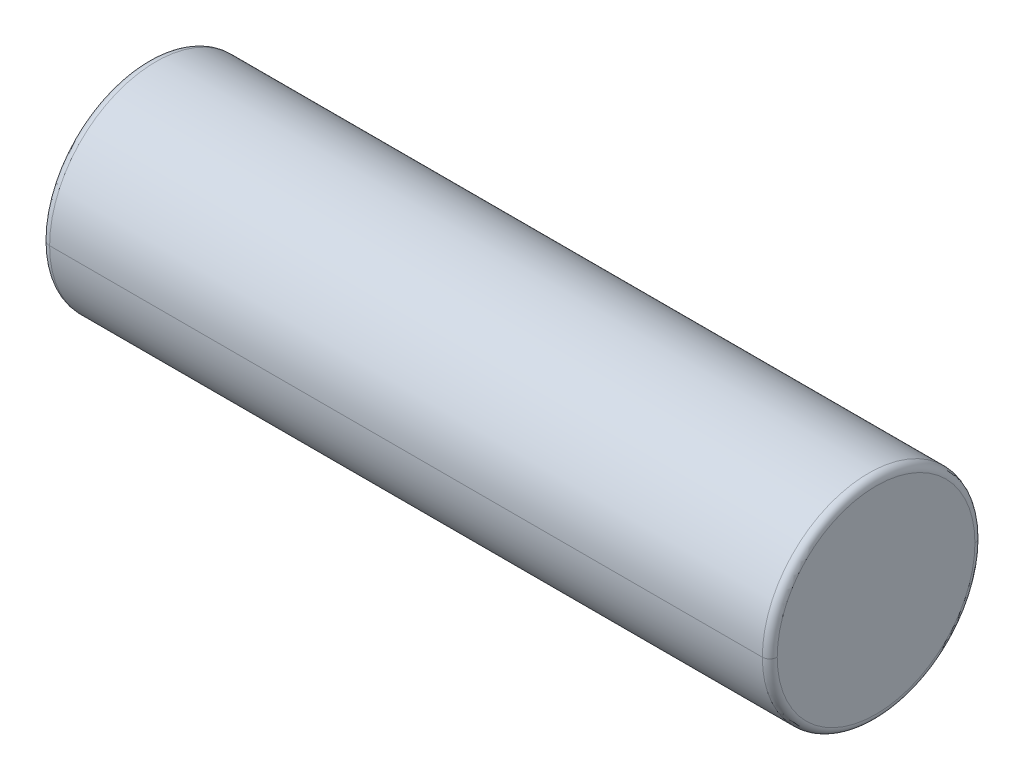
ISO-10303-21;
HEADER;
FILE_DESCRIPTION(('STEP AP214'),'2;1');
FILE_NAME('part.step','',(''),(''),'','','');
FILE_SCHEMA(('AUTOMOTIVE_DESIGN { 1 0 10303 214 1 1 1 1 }'));
ENDSEC;
DATA;
#1=APPLICATION_CONTEXT('core data for automotive mechanical design processes');
#2=APPLICATION_PROTOCOL_DEFINITION('international standard','automotive_design',2000,#1);
#3=PRODUCT_CONTEXT('',#1,'mechanical');
#4=PRODUCT('Part','Part','',(#3));
#5=PRODUCT_RELATED_PRODUCT_CATEGORY('part','',(#4));
#6=PRODUCT_DEFINITION_FORMATION('','',#4);
#7=PRODUCT_DEFINITION_CONTEXT('part definition',#1,'design');
#8=PRODUCT_DEFINITION('design','',#6,#7);
#9=PRODUCT_DEFINITION_SHAPE('','',#8);
#10=(LENGTH_UNIT() NAMED_UNIT(*) SI_UNIT(.MILLI.,.METRE.));
#11=(NAMED_UNIT(*) PLANE_ANGLE_UNIT() SI_UNIT($,.RADIAN.));
#12=(NAMED_UNIT(*) SI_UNIT($,.STERADIAN.) SOLID_ANGLE_UNIT());
#13=UNCERTAINTY_MEASURE_WITH_UNIT(LENGTH_MEASURE(1.E-05),#10,'distance_accuracy_value','');
#14=(GEOMETRIC_REPRESENTATION_CONTEXT(3) GLOBAL_UNCERTAINTY_ASSIGNED_CONTEXT((#13)) GLOBAL_UNIT_ASSIGNED_CONTEXT((#10,
#11,#12)) REPRESENTATION_CONTEXT('',''));
#15=CARTESIAN_POINT('',(0.,0.,0.));
#16=DIRECTION('',(0.,0.,1.));
#17=DIRECTION('',(1.,0.,0.));
#18=AXIS2_PLACEMENT_3D('',#15,#16,#17);
#19=CARTESIAN_POINT('',(0.,0.,0.));
#20=DIRECTION('',(-1.,0.,0.));
#21=DIRECTION('',(0.,9.063827319E-06,0.999999999958924));
#22=AXIS2_PLACEMENT_3D('',#19,#20,#21);
#23=PLANE('',#22);
#24=CARTESIAN_POINT('',(0.,0.,0.));
#25=DIRECTION('',(1.,0.,0.));
#26=DIRECTION('',(0.,-9.06382731887754E-06,-0.999999999958924));
#27=AXIS2_PLACEMENT_3D('',#24,#25,#26);
#28=CIRCLE('',#27,3.85);
#29=CARTESIAN_POINT('',(0.,3.48957351764545E-05,3.84999999984187));
#30=VERTEX_POINT('',#29);
#31=CARTESIAN_POINT('',(0.,-3.48957351764545E-05,-3.84999999984187));
#32=VERTEX_POINT('',#31);
#33=EDGE_CURVE('E11',#30,#32,#28,.T.);
#34=ORIENTED_EDGE('',*,*,#33,.F.);
#35=CARTESIAN_POINT('',(0.,0.,0.));
#36=DIRECTION('',(1.,0.,0.));
#37=DIRECTION('',(0.,-9.06382731887754E-06,-0.999999999958924));
#38=AXIS2_PLACEMENT_3D('',#35,#36,#37);
#39=CIRCLE('',#38,3.85);
#40=EDGE_CURVE('E212',#32,#30,#39,.T.);
#41=ORIENTED_EDGE('',*,*,#40,.F.);
#42=EDGE_LOOP('',(#34,#41));
#43=FACE_BOUND('',#42,.T.);
#44=ADVANCED_FACE('F52',(#43),#23,.T.);
#45=CARTESIAN_POINT('',(0.400000000000005,0.,0.));
#46=DIRECTION('',(-1.,0.,0.));
#47=DIRECTION('',(0.,9.063827319E-06,0.999999999958924));
#48=AXIS2_PLACEMENT_3D('',#45,#46,#47);
#49=TOROIDAL_SURFACE('',#48,3.85,0.4);
#50=CARTESIAN_POINT('',(0.400000000000005,3.48957351764545E-05,3.84999999984187));
#51=DIRECTION('',(0.,-0.999999999958924,9.06382731887754E-06));
#52=DIRECTION('',(0.,9.06382731887754E-06,0.999999999958924));
#53=AXIS2_PLACEMENT_3D('',#50,#51,#52);
#54=CIRCLE('',#53,0.4);
#55=CARTESIAN_POINT('',(0.400000000000005,3.8521266107483E-05,4.24999999982542));
#56=VERTEX_POINT('',#55);
#57=EDGE_CURVE('E184',#56,#30,#54,.T.);
#58=ORIENTED_EDGE('',*,*,#57,.T.);
#59=ORIENTED_EDGE('',*,*,#33,.T.);
#60=CARTESIAN_POINT('',(0.400000000000005,-3.48957351764545E-05,-3.84999999984187));
#61=DIRECTION('',(0.,-0.999999999958924,9.06382731887754E-06));
#62=DIRECTION('',(0.,-9.06382731887754E-06,-0.999999999958924));
#63=AXIS2_PLACEMENT_3D('',#60,#61,#62);
#64=CIRCLE('',#63,0.4);
#65=CARTESIAN_POINT('',(0.400000000000005,-3.8521266107483E-05,-4.24999999982542));
#66=VERTEX_POINT('',#65);
#67=EDGE_CURVE('E216',#32,#66,#64,.T.);
#68=ORIENTED_EDGE('',*,*,#67,.T.);
#69=CARTESIAN_POINT('',(0.400000000000005,0.,0.));
#70=DIRECTION('',(-1.,0.,0.));
#71=DIRECTION('',(0.,-9.06382731887754E-06,-0.999999999958924));
#72=AXIS2_PLACEMENT_3D('',#69,#70,#71);
#73=CIRCLE('',#72,4.25);
#74=EDGE_CURVE('E63',#66,#56,#73,.T.);
#75=ORIENTED_EDGE('',*,*,#74,.T.);
#76=EDGE_LOOP('',(#58,#59,#68,#75));
#77=FACE_BOUND('',#76,.T.);
#78=ADVANCED_FACE('F251',(#77),#49,.T.);
#79=CARTESIAN_POINT('',(1.5,0.,0.));
#80=DIRECTION('',(-1.,0.,0.));
#81=DIRECTION('',(0.,9.063827319E-06,0.999999999958924));
#82=AXIS2_PLACEMENT_3D('',#79,#80,#81);
#83=CYLINDRICAL_SURFACE('',#82,4.25);
#84=DIRECTION('',(-1.,0.,0.));
#85=VECTOR('',#84,1.);
#86=CARTESIAN_POINT('',(0.740000000000005,3.8521266107483E-05,4.24999999982542));
#87=LINE('',#86,#85);
#88=CARTESIAN_POINT('',(1.08,3.8521266107483E-05,4.24999999982542));
#89=VERTEX_POINT('',#88);
#90=EDGE_CURVE('E215',#89,#56,#87,.T.);
#91=ORIENTED_EDGE('',*,*,#90,.T.);
#92=ORIENTED_EDGE('',*,*,#74,.F.);
#93=DIRECTION('',(1.,0.,0.));
#94=VECTOR('',#93,1.);
#95=CARTESIAN_POINT('',(0.740000000000005,-3.8521266107483E-05,-4.24999999982542));
#96=LINE('',#95,#94);
#97=CARTESIAN_POINT('',(1.08,-3.8521266107483E-05,-4.24999999982542));
#98=VERTEX_POINT('',#97);
#99=EDGE_CURVE('E178',#66,#98,#96,.T.);
#100=ORIENTED_EDGE('',*,*,#99,.T.);
#101=CARTESIAN_POINT('',(1.08,0.,0.));
#102=DIRECTION('',(1.,0.,0.));
#103=DIRECTION('',(0.,-9.06382731887754E-06,-0.999999999958924));
#104=AXIS2_PLACEMENT_3D('',#101,#102,#103);
#105=CIRCLE('',#104,4.25);
#106=EDGE_CURVE('E169',#89,#98,#105,.T.);
#107=ORIENTED_EDGE('',*,*,#106,.F.);
#108=EDGE_LOOP('',(#91,#92,#100,#107));
#109=FACE_BOUND('',#108,.T.);
#110=ADVANCED_FACE('F257',(#109),#83,.T.);
#111=CARTESIAN_POINT('',(1.08,0.,0.));
#112=DIRECTION('',(-1.,0.,0.));
#113=DIRECTION('',(0.,9.063827319E-06,0.999999999958924));
#114=AXIS2_PLACEMENT_3D('',#111,#112,#113);
#115=TOROIDAL_SURFACE('',#114,4.67,0.42);
#116=CARTESIAN_POINT('',(1.08,-4.23280735739606E-05,-4.66999999980816));
#117=DIRECTION('',(0.,-0.999999999958924,9.06382731887754E-06));
#118=DIRECTION('',(0.,-9.06382731887754E-06,-0.999999999958924));
#119=AXIS2_PLACEMENT_3D('',#116,#117,#118);
#120=CIRCLE('',#119,0.42);
#121=CARTESIAN_POINT('',(1.5,-4.23280735739606E-05,-4.66999999980816));
#122=VERTEX_POINT('',#121);
#123=EDGE_CURVE('E172',#122,#98,#120,.T.);
#124=ORIENTED_EDGE('',*,*,#123,.T.);
#125=CARTESIAN_POINT('',(1.08,0.,0.));
#126=DIRECTION('',(1.,0.,0.));
#127=DIRECTION('',(0.,-9.06382731887754E-06,-0.999999999958924));
#128=AXIS2_PLACEMENT_3D('',#125,#126,#127);
#129=CIRCLE('',#128,4.25);
#130=EDGE_CURVE('E165',#98,#89,#129,.T.);
#131=ORIENTED_EDGE('',*,*,#130,.T.);
#132=CARTESIAN_POINT('',(1.08,4.23280735739606E-05,4.66999999980816));
#133=DIRECTION('',(0.,-0.999999999958924,9.06382731887754E-06));
#134=DIRECTION('',(0.,9.06382731887754E-06,0.999999999958924));
#135=AXIS2_PLACEMENT_3D('',#132,#133,#134);
#136=CIRCLE('',#135,0.42);
#137=CARTESIAN_POINT('',(1.5,4.23280735739606E-05,4.66999999980816));
#138=VERTEX_POINT('',#137);
#139=EDGE_CURVE('E162',#89,#138,#136,.T.);
#140=ORIENTED_EDGE('',*,*,#139,.T.);
#141=CARTESIAN_POINT('',(1.5,0.,0.));
#142=DIRECTION('',(-1.,0.,0.));
#143=DIRECTION('',(0.,-9.06382731887754E-06,-0.999999999958924));
#144=AXIS2_PLACEMENT_3D('',#141,#142,#143);
#145=CIRCLE('',#144,4.67);
#146=EDGE_CURVE('E150',#138,#122,#145,.T.);
#147=ORIENTED_EDGE('',*,*,#146,.T.);
#148=EDGE_LOOP('',(#124,#131,#140,#147));
#149=FACE_BOUND('',#148,.T.);
#150=ADVANCED_FACE('F163',(#149),#115,.F.);
#151=CARTESIAN_POINT('',(1.5,0.,0.));
#152=DIRECTION('',(-1.,0.,0.));
#153=DIRECTION('',(0.,9.063827319E-06,0.999999999958924));
#154=AXIS2_PLACEMENT_3D('',#151,#152,#153);
#155=PLANE('',#154);
#156=ORIENTED_EDGE('',*,*,#146,.F.);
#157=CARTESIAN_POINT('',(1.5,0.,0.));
#158=DIRECTION('',(-1.,0.,0.));
#159=DIRECTION('',(0.,-9.06382731887754E-06,-0.999999999958924));
#160=AXIS2_PLACEMENT_3D('',#157,#158,#159);
#161=CIRCLE('',#160,4.67);
#162=EDGE_CURVE('E154',#122,#138,#161,.T.);
#163=ORIENTED_EDGE('',*,*,#162,.F.);
#164=EDGE_LOOP('',(#156,#163));
#165=FACE_BOUND('',#164,.T.);
#166=CARTESIAN_POINT('',(1.5,0.,0.));
#167=DIRECTION('',(1.,0.,0.));
#168=DIRECTION('',(0.,9.063827319E-06,0.999999999958924));
#169=AXIS2_PLACEMENT_3D('',#166,#167,#168);
#170=CIRCLE('',#169,6.42);
#171=CARTESIAN_POINT('',(1.5,-5.81897713902713E-05,-6.4199999997363));
#172=VERTEX_POINT('',#171);
#173=CARTESIAN_POINT('',(1.5,5.81897713902713E-05,6.4199999997363));
#174=VERTEX_POINT('',#173);
#175=EDGE_CURVE('E189',#172,#174,#170,.T.);
#176=ORIENTED_EDGE('',*,*,#175,.F.);
#177=CARTESIAN_POINT('',(1.5,0.,0.));
#178=DIRECTION('',(1.,0.,0.));
#179=DIRECTION('',(0.,9.063827319E-06,0.999999999958924));
#180=AXIS2_PLACEMENT_3D('',#177,#178,#179);
#181=CIRCLE('',#180,6.42);
#182=EDGE_CURVE('E129',#174,#172,#181,.T.);
#183=ORIENTED_EDGE('',*,*,#182,.F.);
#184=EDGE_LOOP('',(#176,#183));
#185=FACE_BOUND('',#184,.T.);
#186=ADVANCED_FACE('F152',(#165,#185),#155,.T.);
#187=CARTESIAN_POINT('',(2.08000000000001,0.,0.));
#188=DIRECTION('',(1.,0.,0.));
#189=DIRECTION('',(0.,-9.063827319E-06,-0.999999999958924));
#190=AXIS2_PLACEMENT_3D('',#187,#188,#189);
#191=TOROIDAL_SURFACE('',#190,6.42,0.58);
#192=CARTESIAN_POINT('',(2.08000000000001,-5.81897713902713E-05,-6.4199999997363));
#193=DIRECTION('',(0.,-0.999999999958924,9.06382731912246E-06));
#194=DIRECTION('',(0.,-9.06382731912246E-06,-0.999999999958924));
#195=AXIS2_PLACEMENT_3D('',#192,#193,#194);
#196=CIRCLE('',#195,0.58);
#197=CARTESIAN_POINT('',(2.08000000000001,-6.3446791237487E-05,-6.99999999971246));
#198=VERTEX_POINT('',#197);
#199=EDGE_CURVE('E192',#172,#198,#196,.T.);
#200=ORIENTED_EDGE('',*,*,#199,.T.);
#201=CARTESIAN_POINT('',(2.08000000000001,0.,0.));
#202=DIRECTION('',(-1.,0.,0.));
#203=DIRECTION('',(0.,9.063827319E-06,0.999999999958924));
#204=AXIS2_PLACEMENT_3D('',#201,#202,#203);
#205=CIRCLE('',#204,7.);
#206=CARTESIAN_POINT('',(2.08000000000001,6.3446791237487E-05,6.99999999971246));
#207=VERTEX_POINT('',#206);
#208=EDGE_CURVE('E118',#198,#207,#205,.T.);
#209=ORIENTED_EDGE('',*,*,#208,.T.);
#210=CARTESIAN_POINT('',(2.08000000000001,5.81897713902713E-05,6.4199999997363));
#211=DIRECTION('',(0.,-0.999999999958924,9.06382731912246E-06));
#212=DIRECTION('',(0.,9.06382731912246E-06,0.999999999958924));
#213=AXIS2_PLACEMENT_3D('',#210,#211,#212);
#214=CIRCLE('',#213,0.58);
#215=EDGE_CURVE('E182',#207,#174,#214,.T.);
#216=ORIENTED_EDGE('',*,*,#215,.T.);
#217=ORIENTED_EDGE('',*,*,#182,.T.);
#218=EDGE_LOOP('',(#200,#209,#216,#217));
#219=FACE_BOUND('',#218,.T.);
#220=ADVANCED_FACE('F279',(#219),#191,.T.);
#221=CARTESIAN_POINT('',(49.5,0.,0.));
#222=DIRECTION('',(-1.,0.,0.));
#223=DIRECTION('',(0.,9.063827319E-06,0.999999999958924));
#224=AXIS2_PLACEMENT_3D('',#221,#222,#223);
#225=PLANE('',#224);
#226=CARTESIAN_POINT('',(49.5,0.,0.));
#227=DIRECTION('',(-1.,0.,0.));
#228=DIRECTION('',(0.,9.063827319E-06,0.999999999958924));
#229=AXIS2_PLACEMENT_3D('',#226,#227,#228);
#230=CIRCLE('',#229,6.51);
#231=CARTESIAN_POINT('',(49.5,-5.90055158483649E-05,-6.50999999973259));
#232=VERTEX_POINT('',#231);
#233=CARTESIAN_POINT('',(49.5,5.90055158483649E-05,6.50999999973259));
#234=VERTEX_POINT('',#233);
#235=EDGE_CURVE('E75',#232,#234,#230,.T.);
#236=ORIENTED_EDGE('',*,*,#235,.F.);
#237=CARTESIAN_POINT('',(49.5,0.,0.));
#238=DIRECTION('',(-1.,0.,0.));
#239=DIRECTION('',(0.,9.063827319E-06,0.999999999958924));
#240=AXIS2_PLACEMENT_3D('',#237,#238,#239);
#241=CIRCLE('',#240,6.51);
#242=EDGE_CURVE('E221',#234,#232,#241,.T.);
#243=ORIENTED_EDGE('',*,*,#242,.F.);
#244=EDGE_LOOP('',(#236,#243));
#245=FACE_BOUND('',#244,.T.);
#246=ADVANCED_FACE('F275',(#245),#225,.F.);
#247=CARTESIAN_POINT('',(49.5,0.,0.));
#248=DIRECTION('',(-1.,0.,0.));
#249=DIRECTION('',(0.,9.063827319E-06,0.999999999958924));
#250=AXIS2_PLACEMENT_3D('',#247,#248,#249);
#251=CYLINDRICAL_SURFACE('',#250,7.);
#252=DIRECTION('',(-1.,0.,0.));
#253=VECTOR('',#252,1.);
#254=CARTESIAN_POINT('',(25.545,6.3446791237487E-05,6.99999999971246));
#255=LINE('',#254,#253);
#256=CARTESIAN_POINT('',(49.01,6.3446791237487E-05,6.99999999971246));
#257=VERTEX_POINT('',#256);
#258=EDGE_CURVE('E226',#257,#207,#255,.T.);
#259=ORIENTED_EDGE('',*,*,#258,.T.);
#260=ORIENTED_EDGE('',*,*,#208,.F.);
#261=DIRECTION('',(1.,0.,0.));
#262=VECTOR('',#261,1.);
#263=CARTESIAN_POINT('',(25.545,-6.3446791237487E-05,-6.99999999971246));
#264=LINE('',#263,#262);
#265=CARTESIAN_POINT('',(49.01,-6.3446791237487E-05,-6.99999999971246));
#266=VERTEX_POINT('',#265);
#267=EDGE_CURVE('E209',#198,#266,#264,.T.);
#268=ORIENTED_EDGE('',*,*,#267,.T.);
#269=CARTESIAN_POINT('',(49.01,0.,0.));
#270=DIRECTION('',(1.,0.,0.));
#271=DIRECTION('',(0.,9.063827319E-06,0.999999999958924));
#272=AXIS2_PLACEMENT_3D('',#269,#270,#271);
#273=CIRCLE('',#272,7.);
#274=EDGE_CURVE('E108',#257,#266,#273,.T.);
#275=ORIENTED_EDGE('',*,*,#274,.F.);
#276=EDGE_LOOP('',(#259,#260,#268,#275));
#277=FACE_BOUND('',#276,.T.);
#278=ADVANCED_FACE('F278',(#277),#251,.T.);
#279=CARTESIAN_POINT('',(49.01,0.,0.));
#280=DIRECTION('',(-1.,0.,0.));
#281=DIRECTION('',(0.,9.063827319E-06,0.999999999958924));
#282=AXIS2_PLACEMENT_3D('',#279,#280,#281);
#283=TOROIDAL_SURFACE('',#282,6.51,0.49);
#284=CARTESIAN_POINT('',(49.01,5.90055158483649E-05,6.50999999973259));
#285=DIRECTION('',(0.,-0.999999999958924,9.06382731887754E-06));
#286=DIRECTION('',(0.,9.06382731887754E-06,0.999999999958924));
#287=AXIS2_PLACEMENT_3D('',#284,#285,#286);
#288=CIRCLE('',#287,0.49);
#289=EDGE_CURVE('E56',#234,#257,#288,.T.);
#290=ORIENTED_EDGE('',*,*,#289,.T.);
#291=ORIENTED_EDGE('',*,*,#274,.T.);
#292=CARTESIAN_POINT('',(49.01,-5.90055158483649E-05,-6.50999999973259));
#293=DIRECTION('',(0.,-0.999999999958924,9.06382731887754E-06));
#294=DIRECTION('',(0.,-9.06382731887754E-06,-0.999999999958924));
#295=AXIS2_PLACEMENT_3D('',#292,#293,#294);
#296=CIRCLE('',#295,0.49);
#297=EDGE_CURVE('E225',#266,#232,#296,.T.);
#298=ORIENTED_EDGE('',*,*,#297,.T.);
#299=ORIENTED_EDGE('',*,*,#235,.T.);
#300=EDGE_LOOP('',(#290,#291,#298,#299));
#301=FACE_BOUND('',#300,.T.);
#302=ADVANCED_FACE('F283',(#301),#283,.T.);
#303=CARTESIAN_POINT('',(49.01,0.,0.));
#304=DIRECTION('',(-1.,0.,0.));
#305=DIRECTION('',(0.,9.063827319E-06,0.999999999958924));
#306=AXIS2_PLACEMENT_3D('',#303,#304,#305);
#307=TOROIDAL_SURFACE('',#306,6.51,0.49);
#308=ORIENTED_EDGE('',*,*,#289,.F.);
#309=ORIENTED_EDGE('',*,*,#242,.T.);
#310=ORIENTED_EDGE('',*,*,#297,.F.);
#311=CARTESIAN_POINT('',(49.01,0.,0.));
#312=DIRECTION('',(1.,0.,0.));
#313=DIRECTION('',(0.,9.063827319E-06,0.999999999958924));
#314=AXIS2_PLACEMENT_3D('',#311,#312,#313);
#315=CIRCLE('',#314,7.);
#316=EDGE_CURVE('E211',#266,#257,#315,.T.);
#317=ORIENTED_EDGE('',*,*,#316,.T.);
#318=EDGE_LOOP('',(#308,#309,#310,#317));
#319=FACE_BOUND('',#318,.T.);
#320=ADVANCED_FACE('F280',(#319),#307,.T.);
#321=CARTESIAN_POINT('',(49.5,0.,0.));
#322=DIRECTION('',(-1.,0.,0.));
#323=DIRECTION('',(0.,9.063827319E-06,0.999999999958924));
#324=AXIS2_PLACEMENT_3D('',#321,#322,#323);
#325=CYLINDRICAL_SURFACE('',#324,7.);
#326=ORIENTED_EDGE('',*,*,#258,.F.);
#327=ORIENTED_EDGE('',*,*,#316,.F.);
#328=ORIENTED_EDGE('',*,*,#267,.F.);
#329=CARTESIAN_POINT('',(2.08000000000001,0.,0.));
#330=DIRECTION('',(-1.,0.,0.));
#331=DIRECTION('',(0.,9.063827319E-06,0.999999999958924));
#332=AXIS2_PLACEMENT_3D('',#329,#330,#331);
#333=CIRCLE('',#332,7.);
#334=EDGE_CURVE('E229',#207,#198,#333,.T.);
#335=ORIENTED_EDGE('',*,*,#334,.F.);
#336=EDGE_LOOP('',(#326,#327,#328,#335));
#337=FACE_BOUND('',#336,.T.);
#338=ADVANCED_FACE('F54',(#337),#325,.T.);
#339=CARTESIAN_POINT('',(2.08000000000001,0.,0.));
#340=DIRECTION('',(1.,0.,0.));
#341=DIRECTION('',(0.,-9.063827319E-06,-0.999999999958924));
#342=AXIS2_PLACEMENT_3D('',#339,#340,#341);
#343=TOROIDAL_SURFACE('',#342,6.42,0.58);
#344=ORIENTED_EDGE('',*,*,#199,.F.);
#345=ORIENTED_EDGE('',*,*,#175,.T.);
#346=ORIENTED_EDGE('',*,*,#215,.F.);
#347=ORIENTED_EDGE('',*,*,#334,.T.);
#348=EDGE_LOOP('',(#344,#345,#346,#347));
#349=FACE_BOUND('',#348,.T.);
#350=ADVANCED_FACE('F285',(#349),#343,.T.);
#351=CARTESIAN_POINT('',(1.08,0.,0.));
#352=DIRECTION('',(-1.,0.,0.));
#353=DIRECTION('',(0.,9.063827319E-06,0.999999999958924));
#354=AXIS2_PLACEMENT_3D('',#351,#352,#353);
#355=TOROIDAL_SURFACE('',#354,4.67,0.42);
#356=ORIENTED_EDGE('',*,*,#123,.F.);
#357=ORIENTED_EDGE('',*,*,#162,.T.);
#358=ORIENTED_EDGE('',*,*,#139,.F.);
#359=ORIENTED_EDGE('',*,*,#106,.T.);
#360=EDGE_LOOP('',(#356,#357,#358,#359));
#361=FACE_BOUND('',#360,.T.);
#362=ADVANCED_FACE('F171',(#361),#355,.F.);
#363=CARTESIAN_POINT('',(1.5,0.,0.));
#364=DIRECTION('',(-1.,0.,0.));
#365=DIRECTION('',(0.,9.063827319E-06,0.999999999958924));
#366=AXIS2_PLACEMENT_3D('',#363,#364,#365);
#367=CYLINDRICAL_SURFACE('',#366,4.25);
#368=ORIENTED_EDGE('',*,*,#90,.F.);
#369=ORIENTED_EDGE('',*,*,#130,.F.);
#370=ORIENTED_EDGE('',*,*,#99,.F.);
#371=CARTESIAN_POINT('',(0.400000000000005,0.,0.));
#372=DIRECTION('',(-1.,0.,0.));
#373=DIRECTION('',(0.,-9.06382731887754E-06,-0.999999999958924));
#374=AXIS2_PLACEMENT_3D('',#371,#372,#373);
#375=CIRCLE('',#374,4.25);
#376=EDGE_CURVE('E188',#56,#66,#375,.T.);
#377=ORIENTED_EDGE('',*,*,#376,.F.);
#378=EDGE_LOOP('',(#368,#369,#370,#377));
#379=FACE_BOUND('',#378,.T.);
#380=ADVANCED_FACE('F259',(#379),#367,.T.);
#381=CARTESIAN_POINT('',(0.400000000000005,0.,0.));
#382=DIRECTION('',(-1.,0.,0.));
#383=DIRECTION('',(0.,9.063827319E-06,0.999999999958924));
#384=AXIS2_PLACEMENT_3D('',#381,#382,#383);
#385=TOROIDAL_SURFACE('',#384,3.85,0.4);
#386=ORIENTED_EDGE('',*,*,#57,.F.);
#387=ORIENTED_EDGE('',*,*,#376,.T.);
#388=ORIENTED_EDGE('',*,*,#67,.F.);
#389=ORIENTED_EDGE('',*,*,#40,.T.);
#390=EDGE_LOOP('',(#386,#387,#388,#389));
#391=FACE_BOUND('',#390,.T.);
#392=ADVANCED_FACE('F261',(#391),#385,.T.);
#393=CLOSED_SHELL('',(#44,#78,#110,#150,#186,#220,#246,#278,#302,#320,#338,#350,#362,#380,#392));
#394=MANIFOLD_SOLID_BREP('B2',#393);
#395=ADVANCED_BREP_SHAPE_REPRESENTATION('',(#18,#394),#14);
#396=SHAPE_DEFINITION_REPRESENTATION(#9,#395);
ENDSEC;
END-ISO-10303-21;
